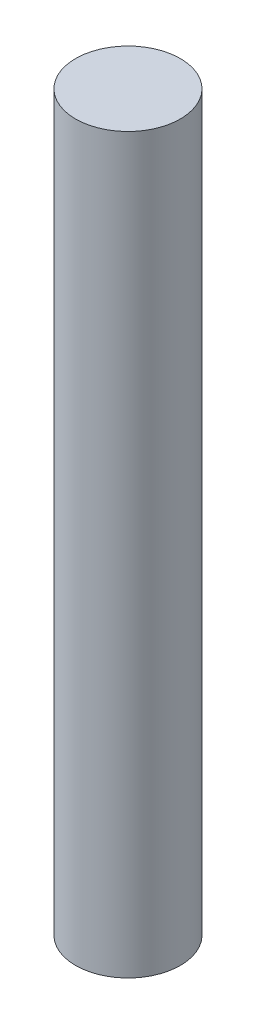
ISO-10303-21;
HEADER;
FILE_DESCRIPTION(('STEP AP214'),'2;1');
FILE_NAME('part.step','',(''),(''),'','','');
FILE_SCHEMA(('AUTOMOTIVE_DESIGN { 1 0 10303 214 1 1 1 1 }'));
ENDSEC;
DATA;
#1=APPLICATION_CONTEXT('core data for automotive mechanical design processes');
#2=APPLICATION_PROTOCOL_DEFINITION('international standard','automotive_design',2000,#1);
#3=PRODUCT_CONTEXT('',#1,'mechanical');
#4=PRODUCT('Part','Part','',(#3));
#5=PRODUCT_RELATED_PRODUCT_CATEGORY('part','',(#4));
#6=PRODUCT_DEFINITION_FORMATION('','',#4);
#7=PRODUCT_DEFINITION_CONTEXT('part definition',#1,'design');
#8=PRODUCT_DEFINITION('design','',#6,#7);
#9=PRODUCT_DEFINITION_SHAPE('','',#8);
#10=(LENGTH_UNIT() NAMED_UNIT(*) SI_UNIT(.MILLI.,.METRE.));
#11=(NAMED_UNIT(*) PLANE_ANGLE_UNIT() SI_UNIT($,.RADIAN.));
#12=(NAMED_UNIT(*) SI_UNIT($,.STERADIAN.) SOLID_ANGLE_UNIT());
#13=UNCERTAINTY_MEASURE_WITH_UNIT(LENGTH_MEASURE(1.E-05),#10,'distance_accuracy_value','');
#14=(GEOMETRIC_REPRESENTATION_CONTEXT(3) GLOBAL_UNCERTAINTY_ASSIGNED_CONTEXT((#13)) GLOBAL_UNIT_ASSIGNED_CONTEXT((#10,
#11,#12)) REPRESENTATION_CONTEXT('',''));
#15=CARTESIAN_POINT('',(0.,0.,0.));
#16=DIRECTION('',(0.,0.,1.));
#17=DIRECTION('',(1.,0.,0.));
#18=AXIS2_PLACEMENT_3D('',#15,#16,#17);
#19=CARTESIAN_POINT('',(0.,35.,0.));
#20=DIRECTION('',(0.,-1.,0.));
#21=DIRECTION('',(0.,0.,-1.));
#22=AXIS2_PLACEMENT_3D('',#19,#20,#21);
#23=CYLINDRICAL_SURFACE('',#22,2.5);
#24=CARTESIAN_POINT('',(0.,35.,0.));
#25=DIRECTION('',(0.,1.,0.));
#26=DIRECTION('',(0.,0.,1.));
#27=AXIS2_PLACEMENT_3D('',#24,#25,#26);
#28=CIRCLE('',#27,2.5);
#29=CARTESIAN_POINT('',(0.,35.,2.5));
#30=VERTEX_POINT('',#29);
#31=EDGE_CURVE('E10',#30,#30,#28,.T.);
#32=ORIENTED_EDGE('',*,*,#31,.F.);
#33=EDGE_LOOP('',(#32));
#34=FACE_BOUND('',#33,.T.);
#35=CARTESIAN_POINT('',(0.,0.,0.));
#36=DIRECTION('',(0.,1.,0.));
#37=DIRECTION('',(0.,0.,1.));
#38=AXIS2_PLACEMENT_3D('',#35,#36,#37);
#39=CIRCLE('',#38,2.5);
#40=CARTESIAN_POINT('',(0.,0.,2.5));
#41=VERTEX_POINT('',#40);
#42=EDGE_CURVE('E36',#41,#41,#39,.T.);
#43=ORIENTED_EDGE('',*,*,#42,.T.);
#44=EDGE_LOOP('',(#43));
#45=FACE_BOUND('',#44,.T.);
#46=ADVANCED_FACE('F33',(#34,#45),#23,.T.);
#47=CARTESIAN_POINT('',(0.,35.,0.));
#48=DIRECTION('',(0.,1.,0.));
#49=DIRECTION('',(0.,0.,1.));
#50=AXIS2_PLACEMENT_3D('',#47,#48,#49);
#51=PLANE('',#50);
#52=ORIENTED_EDGE('',*,*,#31,.T.);
#53=EDGE_LOOP('',(#52));
#54=FACE_BOUND('',#53,.T.);
#55=ADVANCED_FACE('F48',(#54),#51,.T.);
#56=CARTESIAN_POINT('',(0.,0.,0.));
#57=DIRECTION('',(0.,1.,0.));
#58=DIRECTION('',(0.,0.,1.));
#59=AXIS2_PLACEMENT_3D('',#56,#57,#58);
#60=PLANE('',#59);
#61=ORIENTED_EDGE('',*,*,#42,.F.);
#62=EDGE_LOOP('',(#61));
#63=FACE_BOUND('',#62,.T.);
#64=ADVANCED_FACE('F46',(#63),#60,.F.);
#65=CLOSED_SHELL('',(#46,#55,#64));
#66=MANIFOLD_SOLID_BREP('B2',#65);
#67=ADVANCED_BREP_SHAPE_REPRESENTATION('',(#18,#66),#14);
#68=SHAPE_DEFINITION_REPRESENTATION(#9,#67);
ENDSEC;
END-ISO-10303-21;
